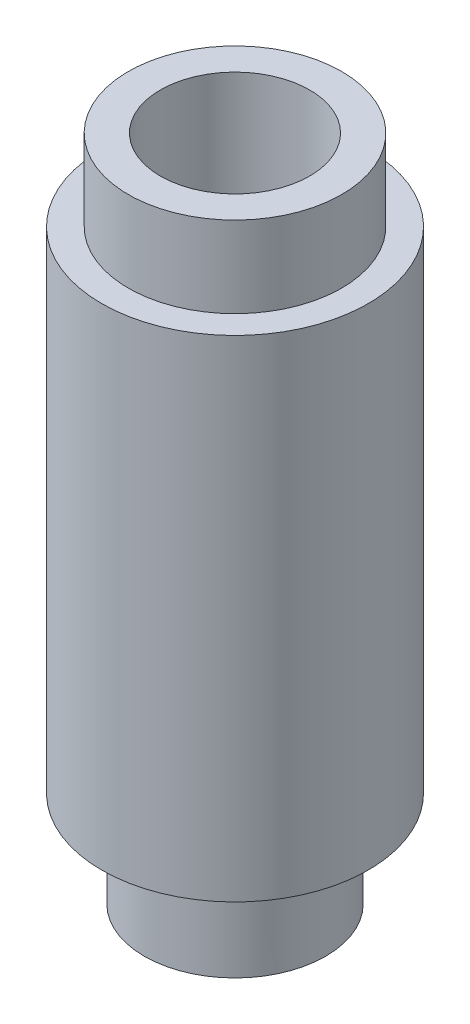
ISO-10303-21;
HEADER;
FILE_DESCRIPTION(('STEP AP214'),'2;1');
FILE_NAME('part.step','',(''),(''),'','','');
FILE_SCHEMA(('AUTOMOTIVE_DESIGN { 1 0 10303 214 1 1 1 1 }'));
ENDSEC;
DATA;
#1=APPLICATION_CONTEXT('core data for automotive mechanical design processes');
#2=APPLICATION_PROTOCOL_DEFINITION('international standard','automotive_design',2000,#1);
#3=PRODUCT_CONTEXT('',#1,'mechanical');
#4=PRODUCT('Part','Part','',(#3));
#5=PRODUCT_RELATED_PRODUCT_CATEGORY('part','',(#4));
#6=PRODUCT_DEFINITION_FORMATION('','',#4);
#7=PRODUCT_DEFINITION_CONTEXT('part definition',#1,'design');
#8=PRODUCT_DEFINITION('design','',#6,#7);
#9=PRODUCT_DEFINITION_SHAPE('','',#8);
#10=(LENGTH_UNIT() NAMED_UNIT(*) SI_UNIT(.MILLI.,.METRE.));
#11=(NAMED_UNIT(*) PLANE_ANGLE_UNIT() SI_UNIT($,.RADIAN.));
#12=(NAMED_UNIT(*) SI_UNIT($,.STERADIAN.) SOLID_ANGLE_UNIT());
#13=UNCERTAINTY_MEASURE_WITH_UNIT(LENGTH_MEASURE(1.E-05),#10,'distance_accuracy_value','');
#14=(GEOMETRIC_REPRESENTATION_CONTEXT(3) GLOBAL_UNCERTAINTY_ASSIGNED_CONTEXT((#13)) GLOBAL_UNIT_ASSIGNED_CONTEXT((#10,
#11,#12)) REPRESENTATION_CONTEXT('',''));
#15=CARTESIAN_POINT('',(0.,0.,0.));
#16=DIRECTION('',(0.,0.,1.));
#17=DIRECTION('',(1.,0.,0.));
#18=AXIS2_PLACEMENT_3D('',#15,#16,#17);
#19=CARTESIAN_POINT('',(0.,46.,0.));
#20=DIRECTION('',(0.,-1.,0.));
#21=DIRECTION('',(0.,0.,-1.));
#22=AXIS2_PLACEMENT_3D('',#19,#20,#21);
#23=CYLINDRICAL_SURFACE('',#22,12.5);
#24=CARTESIAN_POINT('',(0.,46.,0.));
#25=DIRECTION('',(0.,1.,0.));
#26=DIRECTION('',(0.,0.,1.));
#27=AXIS2_PLACEMENT_3D('',#24,#25,#26);
#28=CIRCLE('',#27,12.5);
#29=CARTESIAN_POINT('',(0.,46.,12.5));
#30=VERTEX_POINT('',#29);
#31=EDGE_CURVE('E53',#30,#30,#28,.T.);
#32=ORIENTED_EDGE('',*,*,#31,.F.);
#33=EDGE_LOOP('',(#32));
#34=FACE_BOUND('',#33,.T.);
#35=CARTESIAN_POINT('',(0.,0.,0.));
#36=DIRECTION('',(0.,1.,0.));
#37=DIRECTION('',(0.,0.,1.));
#38=AXIS2_PLACEMENT_3D('',#35,#36,#37);
#39=CIRCLE('',#38,12.5);
#40=CARTESIAN_POINT('',(0.,0.,12.5));
#41=VERTEX_POINT('',#40);
#42=EDGE_CURVE('E59',#41,#41,#39,.T.);
#43=ORIENTED_EDGE('',*,*,#42,.T.);
#44=EDGE_LOOP('',(#43));
#45=FACE_BOUND('',#44,.T.);
#46=ADVANCED_FACE('F41',(#34,#45),#23,.T.);
#47=CARTESIAN_POINT('',(0.,46.,0.));
#48=DIRECTION('',(0.,1.,0.));
#49=DIRECTION('',(0.,0.,1.));
#50=AXIS2_PLACEMENT_3D('',#47,#48,#49);
#51=PLANE('',#50);
#52=CARTESIAN_POINT('',(0.,46.,0.));
#53=DIRECTION('',(0.,1.,0.));
#54=DIRECTION('',(0.,0.,1.));
#55=AXIS2_PLACEMENT_3D('',#52,#53,#54);
#56=CIRCLE('',#55,10.);
#57=CARTESIAN_POINT('',(0.,46.,-10.));
#58=VERTEX_POINT('',#57);
#59=EDGE_CURVE('E48',#58,#58,#56,.T.);
#60=ORIENTED_EDGE('',*,*,#59,.F.);
#61=EDGE_LOOP('',(#60));
#62=FACE_BOUND('',#61,.T.);
#63=ORIENTED_EDGE('',*,*,#31,.T.);
#64=EDGE_LOOP('',(#63));
#65=FACE_BOUND('',#64,.T.);
#66=ADVANCED_FACE('F105',(#62,#65),#51,.T.);
#67=CARTESIAN_POINT('',(0.,0.,0.));
#68=DIRECTION('',(0.,1.,0.));
#69=DIRECTION('',(0.,0.,1.));
#70=AXIS2_PLACEMENT_3D('',#67,#68,#69);
#71=PLANE('',#70);
#72=CARTESIAN_POINT('',(0.,0.,0.));
#73=DIRECTION('',(0.,1.,0.));
#74=DIRECTION('',(0.,0.,1.));
#75=AXIS2_PLACEMENT_3D('',#72,#73,#74);
#76=CIRCLE('',#75,8.5);
#77=CARTESIAN_POINT('',(0.,0.,8.5));
#78=VERTEX_POINT('',#77);
#79=EDGE_CURVE('E10',#78,#78,#76,.F.);
#80=ORIENTED_EDGE('',*,*,#79,.F.);
#81=EDGE_LOOP('',(#80));
#82=FACE_BOUND('',#81,.T.);
#83=ORIENTED_EDGE('',*,*,#42,.F.);
#84=EDGE_LOOP('',(#83));
#85=FACE_BOUND('',#84,.T.);
#86=ADVANCED_FACE('F101',(#82,#85),#71,.F.);
#87=CARTESIAN_POINT('',(0.,53.6,0.));
#88=DIRECTION('',(0.,-1.,0.));
#89=DIRECTION('',(0.,0.,-1.));
#90=AXIS2_PLACEMENT_3D('',#87,#88,#89);
#91=CYLINDRICAL_SURFACE('',#90,10.);
#92=CARTESIAN_POINT('',(0.,53.6,0.));
#93=DIRECTION('',(0.,1.,0.));
#94=DIRECTION('',(0.,0.,1.));
#95=AXIS2_PLACEMENT_3D('',#92,#93,#94);
#96=CIRCLE('',#95,10.);
#97=CARTESIAN_POINT('',(0.,53.6,-10.));
#98=VERTEX_POINT('',#97);
#99=EDGE_CURVE('E62',#98,#98,#96,.T.);
#100=CARTESIAN_POINT('',(0.,53.6,-10.));
#101=CARTESIAN_POINT('',(0.,53.5208333333333,-10.));
#102=CARTESIAN_POINT('',(0.,53.4416666666667,-10.));
#103=CARTESIAN_POINT('',(0.,53.2833333333333,-10.));
#104=CARTESIAN_POINT('',(0.,53.2041666666667,-10.));
#105=CARTESIAN_POINT('',(0.,53.0458333333333,-10.));
#106=CARTESIAN_POINT('',(0.,52.9666666666667,-10.));
#107=CARTESIAN_POINT('',(0.,52.8083333333333,-10.));
#108=CARTESIAN_POINT('',(0.,52.7291666666667,-10.));
#109=CARTESIAN_POINT('',(0.,52.5708333333333,-10.));
#110=CARTESIAN_POINT('',(0.,52.4916666666667,-10.));
#111=CARTESIAN_POINT('',(0.,52.3333333333333,-10.));
#112=CARTESIAN_POINT('',(0.,52.2541666666667,-10.));
#113=CARTESIAN_POINT('',(0.,52.0958333333333,-10.));
#114=CARTESIAN_POINT('',(0.,52.0166666666667,-10.));
#115=CARTESIAN_POINT('',(0.,51.8583333333333,-10.));
#116=CARTESIAN_POINT('',(0.,51.7791666666667,-10.));
#117=CARTESIAN_POINT('',(0.,51.6208333333333,-10.));
#118=CARTESIAN_POINT('',(0.,51.5416666666667,-10.));
#119=CARTESIAN_POINT('',(0.,51.3833333333333,-10.));
#120=CARTESIAN_POINT('',(0.,51.3041666666667,-10.));
#121=CARTESIAN_POINT('',(0.,51.1458333333333,-10.));
#122=CARTESIAN_POINT('',(0.,51.0666666666667,-10.));
#123=CARTESIAN_POINT('',(0.,50.9083333333333,-10.));
#124=CARTESIAN_POINT('',(0.,50.8291666666667,-10.));
#125=CARTESIAN_POINT('',(0.,50.6708333333333,-10.));
#126=CARTESIAN_POINT('',(0.,50.5916666666667,-10.));
#127=CARTESIAN_POINT('',(0.,50.4333333333333,-10.));
#128=CARTESIAN_POINT('',(0.,50.3541666666667,-10.));
#129=CARTESIAN_POINT('',(0.,50.1958333333333,-10.));
#130=CARTESIAN_POINT('',(0.,50.1166666666667,-10.));
#131=CARTESIAN_POINT('',(0.,49.9583333333333,-10.));
#132=CARTESIAN_POINT('',(0.,49.8791666666667,-10.));
#133=CARTESIAN_POINT('',(0.,49.7208333333333,-10.));
#134=CARTESIAN_POINT('',(0.,49.6416666666667,-10.));
#135=CARTESIAN_POINT('',(0.,49.4833333333333,-10.));
#136=CARTESIAN_POINT('',(0.,49.4041666666667,-10.));
#137=CARTESIAN_POINT('',(0.,49.2458333333333,-10.));
#138=CARTESIAN_POINT('',(0.,49.1666666666667,-10.));
#139=CARTESIAN_POINT('',(0.,49.0083333333333,-10.));
#140=CARTESIAN_POINT('',(0.,48.9291666666667,-10.));
#141=CARTESIAN_POINT('',(0.,48.7708333333333,-10.));
#142=CARTESIAN_POINT('',(0.,48.6916666666667,-10.));
#143=CARTESIAN_POINT('',(0.,48.5333333333333,-10.));
#144=CARTESIAN_POINT('',(0.,48.4541666666667,-10.));
#145=CARTESIAN_POINT('',(0.,48.2958333333333,-10.));
#146=CARTESIAN_POINT('',(0.,48.2166666666667,-10.));
#147=CARTESIAN_POINT('',(0.,48.0583333333333,-10.));
#148=CARTESIAN_POINT('',(0.,47.9791666666667,-10.));
#149=CARTESIAN_POINT('',(0.,47.8208333333333,-10.));
#150=CARTESIAN_POINT('',(0.,47.7416666666667,-10.));
#151=CARTESIAN_POINT('',(0.,47.5833333333333,-10.));
#152=CARTESIAN_POINT('',(0.,47.5041666666667,-10.));
#153=CARTESIAN_POINT('',(0.,47.3458333333333,-10.));
#154=CARTESIAN_POINT('',(0.,47.2666666666667,-10.));
#155=CARTESIAN_POINT('',(0.,47.1083333333333,-10.));
#156=CARTESIAN_POINT('',(0.,47.0291666666667,-10.));
#157=CARTESIAN_POINT('',(0.,46.8708333333333,-10.));
#158=CARTESIAN_POINT('',(0.,46.7916666666667,-10.));
#159=CARTESIAN_POINT('',(0.,46.6333333333333,-10.));
#160=CARTESIAN_POINT('',(0.,46.5541666666667,-10.));
#161=CARTESIAN_POINT('',(0.,46.3958333333333,-10.));
#162=CARTESIAN_POINT('',(0.,46.3166666666667,-10.));
#163=CARTESIAN_POINT('',(0.,46.1583333333333,-10.));
#164=CARTESIAN_POINT('',(0.,46.0791666666667,-10.));
#165=CARTESIAN_POINT('',(0.,46.,-10.));
#166=B_SPLINE_CURVE_WITH_KNOTS('',3,(#100,#101,#102,#103,#104,#105,#106,#107,#108,#109,#110,
#111,#112,#113,#114,#115,#116,#117,#118,#119,#120,#121,#122,#123,#124,#125,#126,#127,#128,#129,
#130,#131,#132,#133,#134,#135,#136,#137,#138,#139,#140,#141,#142,#143,#144,#145,#146,#147,#148,
#149,#150,#151,#152,#153,#154,#155,#156,#157,#158,#159,#160,#161,#162,#163,#164,#165),
.UNSPECIFIED.,.F.,.F.,(4,2,2,2,2,2,2,2,2,2,2,2,2,2,2,2,2,2,2,2,2,2,2,2,2,2,2,2,2,2,2,2,4),(0.,
0.237499999999995,0.474999999999996,0.712499999999998,0.95,1.18749999999999,1.425,1.6625,1.9,
2.1375,2.375,2.6125,2.85,3.0875,3.32499999999999,3.5625,3.8,4.0375,4.275,4.5125,4.75,4.9875,
5.225,5.4625,5.7,5.9375,6.175,6.4125,6.65,6.8875,7.125,7.3625,7.6),.UNSPECIFIED.);
#167=EDGE_CURVE('BSEAM92',#98,#58,#166,.T.);
#168=ORIENTED_EDGE('',*,*,#99,.F.);
#169=ORIENTED_EDGE('',*,*,#59,.T.);
#170=ORIENTED_EDGE('',*,*,#167,.T.);
#171=ORIENTED_EDGE('',*,*,#167,.F.);
#172=EDGE_LOOP('',(#168,#170,#169,#171));
#173=FACE_BOUND('',#172,.T.);
#174=ADVANCED_FACE('F92',(#173),#91,.T.);
#175=CARTESIAN_POINT('',(0.,53.6,0.));
#176=DIRECTION('',(0.,1.,0.));
#177=DIRECTION('',(0.,0.,1.));
#178=AXIS2_PLACEMENT_3D('',#175,#176,#177);
#179=PLANE('',#178);
#180=CARTESIAN_POINT('',(0.,53.6,0.));
#181=DIRECTION('',(0.,1.,0.));
#182=DIRECTION('',(0.,0.,1.));
#183=AXIS2_PLACEMENT_3D('',#180,#181,#182);
#184=CIRCLE('',#183,7.);
#185=CARTESIAN_POINT('',(0.,53.6,7.));
#186=VERTEX_POINT('',#185);
#187=EDGE_CURVE('E80',#186,#186,#184,.T.);
#188=ORIENTED_EDGE('',*,*,#187,.F.);
#189=EDGE_LOOP('',(#188));
#190=FACE_BOUND('',#189,.T.);
#191=ORIENTED_EDGE('',*,*,#99,.T.);
#192=EDGE_LOOP('',(#191));
#193=FACE_BOUND('',#192,.T.);
#194=ADVANCED_FACE('F89',(#190,#193),#179,.T.);
#195=CARTESIAN_POINT('',(0.,-9.,0.));
#196=DIRECTION('',(0.,1.,0.));
#197=DIRECTION('',(0.,0.,1.));
#198=AXIS2_PLACEMENT_3D('',#195,#196,#197);
#199=CYLINDRICAL_SURFACE('',#198,8.5);
#200=CARTESIAN_POINT('',(0.,-9.,0.));
#201=DIRECTION('',(0.,-1.,0.));
#202=DIRECTION('',(0.,0.,-1.));
#203=AXIS2_PLACEMENT_3D('',#200,#201,#202);
#204=CIRCLE('',#203,8.5);
#205=CARTESIAN_POINT('',(0.,-9.,-8.5));
#206=VERTEX_POINT('',#205);
#207=EDGE_CURVE('E70',#206,#206,#204,.T.);
#208=ORIENTED_EDGE('',*,*,#207,.F.);
#209=EDGE_LOOP('',(#208));
#210=FACE_BOUND('',#209,.T.);
#211=ORIENTED_EDGE('',*,*,#79,.T.);
#212=EDGE_LOOP('',(#211));
#213=FACE_BOUND('',#212,.T.);
#214=ADVANCED_FACE('F91',(#210,#213),#199,.T.);
#215=CARTESIAN_POINT('',(0.,-9.,0.));
#216=DIRECTION('',(0.,-1.,0.));
#217=DIRECTION('',(0.,0.,-1.));
#218=AXIS2_PLACEMENT_3D('',#215,#216,#217);
#219=PLANE('',#218);
#220=CARTESIAN_POINT('',(0.,-9.,0.));
#221=DIRECTION('',(0.,1.,0.));
#222=DIRECTION('',(0.,0.,1.));
#223=AXIS2_PLACEMENT_3D('',#220,#221,#222);
#224=CIRCLE('',#223,7.);
#225=CARTESIAN_POINT('',(0.,-9.,7.));
#226=VERTEX_POINT('',#225);
#227=EDGE_CURVE('E75',#226,#226,#224,.T.);
#228=ORIENTED_EDGE('',*,*,#227,.T.);
#229=EDGE_LOOP('',(#228));
#230=FACE_BOUND('',#229,.T.);
#231=ORIENTED_EDGE('',*,*,#207,.T.);
#232=EDGE_LOOP('',(#231));
#233=FACE_BOUND('',#232,.T.);
#234=ADVANCED_FACE('F98',(#230,#233),#219,.T.);
#235=CARTESIAN_POINT('',(0.,-9.,0.));
#236=DIRECTION('',(0.,1.,0.));
#237=DIRECTION('',(0.,0.,1.));
#238=AXIS2_PLACEMENT_3D('',#235,#236,#237);
#239=CYLINDRICAL_SURFACE('',#238,7.);
#240=ORIENTED_EDGE('',*,*,#227,.F.);
#241=EDGE_LOOP('',(#240));
#242=FACE_BOUND('',#241,.T.);
#243=ORIENTED_EDGE('',*,*,#187,.T.);
#244=EDGE_LOOP('',(#243));
#245=FACE_BOUND('',#244,.T.);
#246=ADVANCED_FACE('F87',(#242,#245),#239,.F.);
#247=CLOSED_SHELL('',(#46,#66,#86,#174,#194,#214,#234,#246));
#248=MANIFOLD_SOLID_BREP('B2',#247);
#249=ADVANCED_BREP_SHAPE_REPRESENTATION('',(#18,#248),#14);
#250=SHAPE_DEFINITION_REPRESENTATION(#9,#249);
ENDSEC;
END-ISO-10303-21;
